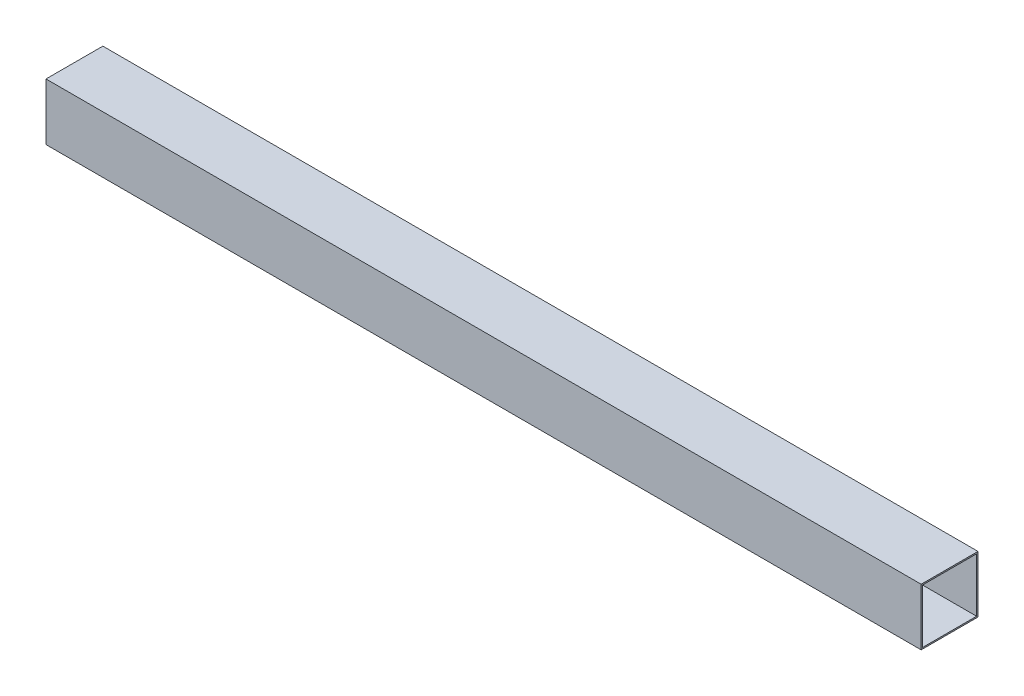
ISO-10303-21;
HEADER;
FILE_DESCRIPTION(('STEP AP214'),'2;1');
FILE_NAME('part.step','',(''),(''),'','','');
FILE_SCHEMA(('AUTOMOTIVE_DESIGN { 1 0 10303 214 1 1 1 1 }'));
ENDSEC;
DATA;
#1=APPLICATION_CONTEXT('core data for automotive mechanical design processes');
#2=APPLICATION_PROTOCOL_DEFINITION('international standard','automotive_design',2000,#1);
#3=PRODUCT_CONTEXT('',#1,'mechanical');
#4=PRODUCT('Part','Part','',(#3));
#5=PRODUCT_RELATED_PRODUCT_CATEGORY('part','',(#4));
#6=PRODUCT_DEFINITION_FORMATION('','',#4);
#7=PRODUCT_DEFINITION_CONTEXT('part definition',#1,'design');
#8=PRODUCT_DEFINITION('design','',#6,#7);
#9=PRODUCT_DEFINITION_SHAPE('','',#8);
#10=(LENGTH_UNIT() NAMED_UNIT(*) SI_UNIT(.MILLI.,.METRE.));
#11=(NAMED_UNIT(*) PLANE_ANGLE_UNIT() SI_UNIT($,.RADIAN.));
#12=(NAMED_UNIT(*) SI_UNIT($,.STERADIAN.) SOLID_ANGLE_UNIT());
#13=UNCERTAINTY_MEASURE_WITH_UNIT(LENGTH_MEASURE(1.E-05),#10,'distance_accuracy_value','');
#14=(GEOMETRIC_REPRESENTATION_CONTEXT(3) GLOBAL_UNCERTAINTY_ASSIGNED_CONTEXT((#13)) GLOBAL_UNIT_ASSIGNED_CONTEXT((#10,
#11,#12)) REPRESENTATION_CONTEXT('',''));
#15=CARTESIAN_POINT('',(0.,0.,0.));
#16=DIRECTION('',(0.,0.,1.));
#17=DIRECTION('',(1.,0.,0.));
#18=AXIS2_PLACEMENT_3D('',#15,#16,#17);
#19=CARTESIAN_POINT('',(782.,25.4,25.4));
#20=DIRECTION('',(0.,-1.,0.));
#21=DIRECTION('',(0.,0.,-1.));
#22=AXIS2_PLACEMENT_3D('',#19,#20,#21);
#23=PLANE('',#22);
#24=DIRECTION('',(0.,0.,1.));
#25=VECTOR('',#24,1.);
#26=CARTESIAN_POINT('',(0.,25.4,25.4));
#27=LINE('',#26,#25);
#28=CARTESIAN_POINT('',(0.,25.4,-25.4));
#29=VERTEX_POINT('',#28);
#30=CARTESIAN_POINT('',(0.,25.4,25.4));
#31=VERTEX_POINT('',#30);
#32=EDGE_CURVE('E160',#29,#31,#27,.T.);
#33=ORIENTED_EDGE('',*,*,#32,.T.);
#34=DIRECTION('',(-1.,0.,0.));
#35=VECTOR('',#34,1.);
#36=CARTESIAN_POINT('',(782.,25.4,25.4));
#37=LINE('',#36,#35);
#38=CARTESIAN_POINT('',(782.,25.4,25.4));
#39=VERTEX_POINT('',#38);
#40=EDGE_CURVE('E12',#39,#31,#37,.T.);
#41=ORIENTED_EDGE('',*,*,#40,.F.);
#42=DIRECTION('',(0.,0.,1.));
#43=VECTOR('',#42,1.);
#44=CARTESIAN_POINT('',(782.,25.4,25.4));
#45=LINE('',#44,#43);
#46=CARTESIAN_POINT('',(782.,25.4,-25.4));
#47=VERTEX_POINT('',#46);
#48=EDGE_CURVE('E134',#47,#39,#45,.T.);
#49=ORIENTED_EDGE('',*,*,#48,.F.);
#50=DIRECTION('',(-1.,0.,0.));
#51=VECTOR('',#50,1.);
#52=CARTESIAN_POINT('',(782.,25.4,-25.4));
#53=LINE('',#52,#51);
#54=EDGE_CURVE('E167',#47,#29,#53,.T.);
#55=ORIENTED_EDGE('',*,*,#54,.T.);
#56=EDGE_LOOP('',(#33,#41,#49,#55));
#57=FACE_BOUND('',#56,.T.);
#58=ADVANCED_FACE('F53',(#57),#23,.F.);
#59=CARTESIAN_POINT('',(782.,25.4,25.4));
#60=DIRECTION('',(0.,0.,-1.));
#61=DIRECTION('',(-1.,0.,0.));
#62=AXIS2_PLACEMENT_3D('',#59,#60,#61);
#63=PLANE('',#62);
#64=DIRECTION('',(0.,-1.,0.));
#65=VECTOR('',#64,1.);
#66=CARTESIAN_POINT('',(0.,25.4,25.4));
#67=LINE('',#66,#65);
#68=CARTESIAN_POINT('',(0.,-25.4,25.4));
#69=VERTEX_POINT('',#68);
#70=EDGE_CURVE('E139',#31,#69,#67,.T.);
#71=ORIENTED_EDGE('',*,*,#70,.T.);
#72=DIRECTION('',(-1.,0.,0.));
#73=VECTOR('',#72,1.);
#74=CARTESIAN_POINT('',(782.,-25.4,25.4));
#75=LINE('',#74,#73);
#76=CARTESIAN_POINT('',(782.,-25.4,25.4));
#77=VERTEX_POINT('',#76);
#78=EDGE_CURVE('E63',#77,#69,#75,.T.);
#79=ORIENTED_EDGE('',*,*,#78,.F.);
#80=DIRECTION('',(0.,-1.,0.));
#81=VECTOR('',#80,1.);
#82=CARTESIAN_POINT('',(782.,25.4,25.4));
#83=LINE('',#82,#81);
#84=EDGE_CURVE('E128',#39,#77,#83,.T.);
#85=ORIENTED_EDGE('',*,*,#84,.F.);
#86=ORIENTED_EDGE('',*,*,#40,.T.);
#87=EDGE_LOOP('',(#71,#79,#85,#86));
#88=FACE_BOUND('',#87,.T.);
#89=ADVANCED_FACE('F138',(#88),#63,.F.);
#90=CARTESIAN_POINT('',(782.,-25.4,-25.4));
#91=DIRECTION('',(0.,1.,0.));
#92=DIRECTION('',(0.,0.,1.));
#93=AXIS2_PLACEMENT_3D('',#90,#91,#92);
#94=PLANE('',#93);
#95=DIRECTION('',(0.,0.,-1.));
#96=VECTOR('',#95,1.);
#97=CARTESIAN_POINT('',(0.,-25.4,-25.4));
#98=LINE('',#97,#96);
#99=CARTESIAN_POINT('',(0.,-25.4,-25.4));
#100=VERTEX_POINT('',#99);
#101=EDGE_CURVE('E101',#69,#100,#98,.T.);
#102=ORIENTED_EDGE('',*,*,#101,.T.);
#103=DIRECTION('',(-1.,0.,0.));
#104=VECTOR('',#103,1.);
#105=CARTESIAN_POINT('',(782.,-25.4,-25.4));
#106=LINE('',#105,#104);
#107=CARTESIAN_POINT('',(782.,-25.4,-25.4));
#108=VERTEX_POINT('',#107);
#109=EDGE_CURVE('E140',#108,#100,#106,.T.);
#110=ORIENTED_EDGE('',*,*,#109,.F.);
#111=DIRECTION('',(0.,0.,-1.));
#112=VECTOR('',#111,1.);
#113=CARTESIAN_POINT('',(782.,-25.4,-25.4));
#114=LINE('',#113,#112);
#115=EDGE_CURVE('E132',#77,#108,#114,.T.);
#116=ORIENTED_EDGE('',*,*,#115,.F.);
#117=ORIENTED_EDGE('',*,*,#78,.T.);
#118=EDGE_LOOP('',(#102,#110,#116,#117));
#119=FACE_BOUND('',#118,.T.);
#120=ADVANCED_FACE('F142',(#119),#94,.F.);
#121=CARTESIAN_POINT('',(782.,24.1554,24.1554));
#122=DIRECTION('',(0.,0.,-1.));
#123=DIRECTION('',(-1.,0.,0.));
#124=AXIS2_PLACEMENT_3D('',#121,#122,#123);
#125=PLANE('',#124);
#126=DIRECTION('',(0.,-1.,0.));
#127=VECTOR('',#126,1.);
#128=CARTESIAN_POINT('',(0.,24.1554,24.1554));
#129=LINE('',#128,#127);
#130=CARTESIAN_POINT('',(0.,24.1554,24.1554));
#131=VERTEX_POINT('',#130);
#132=CARTESIAN_POINT('',(0.,-24.1554,24.1554));
#133=VERTEX_POINT('',#132);
#134=EDGE_CURVE('E148',#131,#133,#129,.T.);
#135=ORIENTED_EDGE('',*,*,#134,.F.);
#136=DIRECTION('',(-1.,0.,0.));
#137=VECTOR('',#136,1.);
#138=CARTESIAN_POINT('',(782.,24.1554,24.1554));
#139=LINE('',#138,#137);
#140=CARTESIAN_POINT('',(782.,24.1554,24.1554));
#141=VERTEX_POINT('',#140);
#142=EDGE_CURVE('E57',#141,#131,#139,.T.);
#143=ORIENTED_EDGE('',*,*,#142,.F.);
#144=DIRECTION('',(0.,-1.,0.));
#145=VECTOR('',#144,1.);
#146=CARTESIAN_POINT('',(782.,24.1554,24.1554));
#147=LINE('',#146,#145);
#148=CARTESIAN_POINT('',(782.,-24.1554,24.1554));
#149=VERTEX_POINT('',#148);
#150=EDGE_CURVE('E166',#141,#149,#147,.T.);
#151=ORIENTED_EDGE('',*,*,#150,.T.);
#152=DIRECTION('',(-1.,0.,0.));
#153=VECTOR('',#152,1.);
#154=CARTESIAN_POINT('',(782.,-24.1554,24.1554));
#155=LINE('',#154,#153);
#156=EDGE_CURVE('E144',#149,#133,#155,.T.);
#157=ORIENTED_EDGE('',*,*,#156,.T.);
#158=EDGE_LOOP('',(#135,#143,#151,#157));
#159=FACE_BOUND('',#158,.T.);
#160=ADVANCED_FACE('F55',(#159),#125,.T.);
#161=CARTESIAN_POINT('',(782.,24.1554,24.1554));
#162=DIRECTION('',(0.,-1.,0.));
#163=DIRECTION('',(0.,0.,-1.));
#164=AXIS2_PLACEMENT_3D('',#161,#162,#163);
#165=PLANE('',#164);
#166=DIRECTION('',(0.,0.,1.));
#167=VECTOR('',#166,1.);
#168=CARTESIAN_POINT('',(0.,24.1554,24.1554));
#169=LINE('',#168,#167);
#170=CARTESIAN_POINT('',(0.,24.1554,-24.1554));
#171=VERTEX_POINT('',#170);
#172=EDGE_CURVE('E151',#171,#131,#169,.T.);
#173=ORIENTED_EDGE('',*,*,#172,.F.);
#174=DIRECTION('',(-1.,0.,0.));
#175=VECTOR('',#174,1.);
#176=CARTESIAN_POINT('',(782.,24.1554,-24.1554));
#177=LINE('',#176,#175);
#178=CARTESIAN_POINT('',(782.,24.1554,-24.1554));
#179=VERTEX_POINT('',#178);
#180=EDGE_CURVE('E172',#179,#171,#177,.T.);
#181=ORIENTED_EDGE('',*,*,#180,.F.);
#182=DIRECTION('',(0.,0.,1.));
#183=VECTOR('',#182,1.);
#184=CARTESIAN_POINT('',(782.,24.1554,24.1554));
#185=LINE('',#184,#183);
#186=EDGE_CURVE('E181',#179,#141,#185,.T.);
#187=ORIENTED_EDGE('',*,*,#186,.T.);
#188=ORIENTED_EDGE('',*,*,#142,.T.);
#189=EDGE_LOOP('',(#173,#181,#187,#188));
#190=FACE_BOUND('',#189,.T.);
#191=ADVANCED_FACE('F179',(#190),#165,.T.);
#192=CARTESIAN_POINT('',(782.,-24.1554,-24.1554));
#193=DIRECTION('',(0.,0.,1.));
#194=DIRECTION('',(1.,0.,0.));
#195=AXIS2_PLACEMENT_3D('',#192,#193,#194);
#196=PLANE('',#195);
#197=DIRECTION('',(0.,1.,0.));
#198=VECTOR('',#197,1.);
#199=CARTESIAN_POINT('',(0.,-24.1554,-24.1554));
#200=LINE('',#199,#198);
#201=CARTESIAN_POINT('',(0.,-24.1554,-24.1554));
#202=VERTEX_POINT('',#201);
#203=EDGE_CURVE('E154',#202,#171,#200,.T.);
#204=ORIENTED_EDGE('',*,*,#203,.F.);
#205=DIRECTION('',(-1.,0.,0.));
#206=VECTOR('',#205,1.);
#207=CARTESIAN_POINT('',(782.,-24.1554,-24.1554));
#208=LINE('',#207,#206);
#209=CARTESIAN_POINT('',(782.,-24.1554,-24.1554));
#210=VERTEX_POINT('',#209);
#211=EDGE_CURVE('E171',#210,#202,#208,.T.);
#212=ORIENTED_EDGE('',*,*,#211,.F.);
#213=DIRECTION('',(0.,1.,0.));
#214=VECTOR('',#213,1.);
#215=CARTESIAN_POINT('',(782.,-24.1554,-24.1554));
#216=LINE('',#215,#214);
#217=EDGE_CURVE('E188',#210,#179,#216,.T.);
#218=ORIENTED_EDGE('',*,*,#217,.T.);
#219=ORIENTED_EDGE('',*,*,#180,.T.);
#220=EDGE_LOOP('',(#204,#212,#218,#219));
#221=FACE_BOUND('',#220,.T.);
#222=ADVANCED_FACE('F186',(#221),#196,.T.);
#223=CARTESIAN_POINT('',(782.,-24.1554,-24.1554));
#224=DIRECTION('',(0.,1.,0.));
#225=DIRECTION('',(0.,0.,1.));
#226=AXIS2_PLACEMENT_3D('',#223,#224,#225);
#227=PLANE('',#226);
#228=DIRECTION('',(0.,0.,-1.));
#229=VECTOR('',#228,1.);
#230=CARTESIAN_POINT('',(0.,-24.1554,-24.1554));
#231=LINE('',#230,#229);
#232=EDGE_CURVE('E157',#133,#202,#231,.T.);
#233=ORIENTED_EDGE('',*,*,#232,.F.);
#234=ORIENTED_EDGE('',*,*,#156,.F.);
#235=DIRECTION('',(0.,0.,-1.));
#236=VECTOR('',#235,1.);
#237=CARTESIAN_POINT('',(782.,-24.1554,-24.1554));
#238=LINE('',#237,#236);
#239=EDGE_CURVE('E193',#149,#210,#238,.T.);
#240=ORIENTED_EDGE('',*,*,#239,.T.);
#241=ORIENTED_EDGE('',*,*,#211,.T.);
#242=EDGE_LOOP('',(#233,#234,#240,#241));
#243=FACE_BOUND('',#242,.T.);
#244=ADVANCED_FACE('F195',(#243),#227,.T.);
#245=CARTESIAN_POINT('',(782.,-25.4,-25.4));
#246=DIRECTION('',(0.,0.,1.));
#247=DIRECTION('',(0.,-1.,0.));
#248=AXIS2_PLACEMENT_3D('',#245,#246,#247);
#249=PLANE('',#248);
#250=DIRECTION('',(0.,1.,0.));
#251=VECTOR('',#250,1.);
#252=CARTESIAN_POINT('',(0.,-25.4,-25.4));
#253=LINE('',#252,#251);
#254=EDGE_CURVE('E107',#100,#29,#253,.T.);
#255=ORIENTED_EDGE('',*,*,#254,.T.);
#256=ORIENTED_EDGE('',*,*,#54,.F.);
#257=DIRECTION('',(0.,1.,0.));
#258=VECTOR('',#257,1.);
#259=CARTESIAN_POINT('',(782.,-25.4,-25.4));
#260=LINE('',#259,#258);
#261=EDGE_CURVE('E72',#108,#47,#260,.T.);
#262=ORIENTED_EDGE('',*,*,#261,.F.);
#263=ORIENTED_EDGE('',*,*,#109,.T.);
#264=EDGE_LOOP('',(#255,#256,#262,#263));
#265=FACE_BOUND('',#264,.T.);
#266=ADVANCED_FACE('F200',(#265),#249,.F.);
#267=CARTESIAN_POINT('',(782.,0.,0.));
#268=DIRECTION('',(1.,0.,0.));
#269=DIRECTION('',(0.,0.,-1.));
#270=AXIS2_PLACEMENT_3D('',#267,#268,#269);
#271=PLANE('',#270);
#272=ORIENTED_EDGE('',*,*,#150,.F.);
#273=ORIENTED_EDGE('',*,*,#186,.F.);
#274=ORIENTED_EDGE('',*,*,#217,.F.);
#275=ORIENTED_EDGE('',*,*,#239,.F.);
#276=EDGE_LOOP('',(#272,#273,#274,#275));
#277=FACE_BOUND('',#276,.T.);
#278=ORIENTED_EDGE('',*,*,#48,.T.);
#279=ORIENTED_EDGE('',*,*,#84,.T.);
#280=ORIENTED_EDGE('',*,*,#115,.T.);
#281=ORIENTED_EDGE('',*,*,#261,.T.);
#282=EDGE_LOOP('',(#278,#279,#280,#281));
#283=FACE_BOUND('',#282,.T.);
#284=ADVANCED_FACE('F130',(#277,#283),#271,.T.);
#285=CARTESIAN_POINT('',(0.,0.,0.));
#286=DIRECTION('',(1.,0.,0.));
#287=DIRECTION('',(0.,0.,-1.));
#288=AXIS2_PLACEMENT_3D('',#285,#286,#287);
#289=PLANE('',#288);
#290=ORIENTED_EDGE('',*,*,#134,.T.);
#291=ORIENTED_EDGE('',*,*,#232,.T.);
#292=ORIENTED_EDGE('',*,*,#203,.T.);
#293=ORIENTED_EDGE('',*,*,#172,.T.);
#294=EDGE_LOOP('',(#290,#291,#292,#293));
#295=FACE_BOUND('',#294,.T.);
#296=ORIENTED_EDGE('',*,*,#32,.F.);
#297=ORIENTED_EDGE('',*,*,#254,.F.);
#298=ORIENTED_EDGE('',*,*,#101,.F.);
#299=ORIENTED_EDGE('',*,*,#70,.F.);
#300=EDGE_LOOP('',(#296,#297,#298,#299));
#301=FACE_BOUND('',#300,.T.);
#302=ADVANCED_FACE('F184',(#295,#301),#289,.F.);
#303=CLOSED_SHELL('',(#58,#89,#120,#160,#191,#222,#244,#266,#284,#302));
#304=MANIFOLD_SOLID_BREP('B2',#303);
#305=ADVANCED_BREP_SHAPE_REPRESENTATION('',(#18,#304),#14);
#306=SHAPE_DEFINITION_REPRESENTATION(#9,#305);
ENDSEC;
END-ISO-10303-21;
